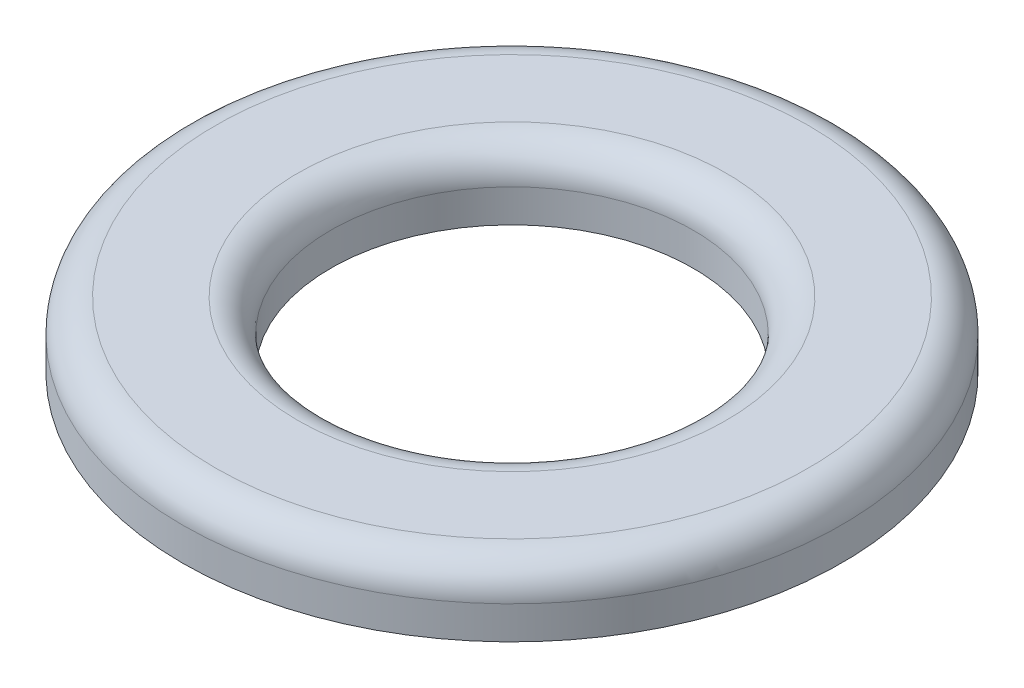
ISO-10303-21;
HEADER;
FILE_DESCRIPTION(('STEP AP214'),'2;1');
FILE_NAME('part.step','',(''),(''),'','','');
FILE_SCHEMA(('AUTOMOTIVE_DESIGN { 1 0 10303 214 1 1 1 1 }'));
ENDSEC;
DATA;
#1=APPLICATION_CONTEXT('core data for automotive mechanical design processes');
#2=APPLICATION_PROTOCOL_DEFINITION('international standard','automotive_design',2000,#1);
#3=PRODUCT_CONTEXT('',#1,'mechanical');
#4=PRODUCT('Part','Part','',(#3));
#5=PRODUCT_RELATED_PRODUCT_CATEGORY('part','',(#4));
#6=PRODUCT_DEFINITION_FORMATION('','',#4);
#7=PRODUCT_DEFINITION_CONTEXT('part definition',#1,'design');
#8=PRODUCT_DEFINITION('design','',#6,#7);
#9=PRODUCT_DEFINITION_SHAPE('','',#8);
#10=(LENGTH_UNIT() NAMED_UNIT(*) SI_UNIT(.MILLI.,.METRE.));
#11=(NAMED_UNIT(*) PLANE_ANGLE_UNIT() SI_UNIT($,.RADIAN.));
#12=(NAMED_UNIT(*) SI_UNIT($,.STERADIAN.) SOLID_ANGLE_UNIT());
#13=UNCERTAINTY_MEASURE_WITH_UNIT(LENGTH_MEASURE(1.E-05),#10,'distance_accuracy_value','');
#14=(GEOMETRIC_REPRESENTATION_CONTEXT(3) GLOBAL_UNCERTAINTY_ASSIGNED_CONTEXT((#13)) GLOBAL_UNIT_ASSIGNED_CONTEXT((#10,
#11,#12)) REPRESENTATION_CONTEXT('',''));
#15=CARTESIAN_POINT('',(0.,0.,0.));
#16=DIRECTION('',(0.,0.,1.));
#17=DIRECTION('',(1.,0.,0.));
#18=AXIS2_PLACEMENT_3D('',#15,#16,#17);
#19=CARTESIAN_POINT('',(0.,0.,0.));
#20=DIRECTION('',(0.,1.,0.));
#21=DIRECTION('',(0.,0.,1.));
#22=AXIS2_PLACEMENT_3D('',#19,#20,#21);
#23=PLANE('',#22);
#24=CARTESIAN_POINT('',(0.,0.,0.));
#25=DIRECTION('',(0.,1.,0.));
#26=DIRECTION('',(0.,0.,1.));
#27=AXIS2_PLACEMENT_3D('',#24,#25,#26);
#28=CIRCLE('',#27,27.5);
#29=CARTESIAN_POINT('',(0.,0.,27.5));
#30=VERTEX_POINT('',#29);
#31=EDGE_CURVE('E48',#30,#30,#28,.T.);
#32=ORIENTED_EDGE('',*,*,#31,.T.);
#33=EDGE_LOOP('',(#32));
#34=FACE_BOUND('',#33,.T.);
#35=CARTESIAN_POINT('',(0.,0.,0.));
#36=DIRECTION('',(0.,-1.,0.));
#37=DIRECTION('',(0.,0.,-1.));
#38=AXIS2_PLACEMENT_3D('',#35,#36,#37);
#39=CIRCLE('',#38,40.);
#40=CARTESIAN_POINT('',(0.,0.,-40.));
#41=VERTEX_POINT('',#40);
#42=EDGE_CURVE('E83',#41,#41,#39,.T.);
#43=ORIENTED_EDGE('',*,*,#42,.T.);
#44=EDGE_LOOP('',(#43));
#45=FACE_BOUND('',#44,.T.);
#46=ADVANCED_FACE('F31',(#34,#45),#23,.F.);
#47=CARTESIAN_POINT('',(0.,10.,0.));
#48=DIRECTION('',(0.,1.,0.));
#49=DIRECTION('',(0.,0.,1.));
#50=AXIS2_PLACEMENT_3D('',#47,#48,#49);
#51=PLANE('',#50);
#52=CARTESIAN_POINT('',(0.,10.,0.));
#53=DIRECTION('',(0.,1.,0.));
#54=DIRECTION('',(0.,0.,1.));
#55=AXIS2_PLACEMENT_3D('',#52,#53,#54);
#56=CIRCLE('',#55,32.5);
#57=CARTESIAN_POINT('',(0.,10.,32.5));
#58=VERTEX_POINT('',#57);
#59=EDGE_CURVE('E43',#58,#58,#56,.F.);
#60=ORIENTED_EDGE('',*,*,#59,.T.);
#61=EDGE_LOOP('',(#60));
#62=FACE_BOUND('',#61,.T.);
#63=CARTESIAN_POINT('',(0.,10.,0.));
#64=DIRECTION('',(0.,1.,0.));
#65=DIRECTION('',(0.,0.,1.));
#66=AXIS2_PLACEMENT_3D('',#63,#64,#65);
#67=CIRCLE('',#66,45.);
#68=CARTESIAN_POINT('',(0.,10.,45.));
#69=VERTEX_POINT('',#68);
#70=EDGE_CURVE('E57',#69,#69,#67,.T.);
#71=ORIENTED_EDGE('',*,*,#70,.T.);
#72=EDGE_LOOP('',(#71));
#73=FACE_BOUND('',#72,.T.);
#74=ADVANCED_FACE('F62',(#62,#73),#51,.T.);
#75=CARTESIAN_POINT('',(0.,0.,0.));
#76=DIRECTION('',(0.,-1.,0.));
#77=DIRECTION('',(0.,0.,-1.));
#78=AXIS2_PLACEMENT_3D('',#75,#76,#77);
#79=CIRCLE('',#78,43.);
#80=CARTESIAN_POINT('',(0.,0.,-43.));
#81=VERTEX_POINT('',#80);
#82=EDGE_CURVE('E10',#81,#81,#79,.T.);
#83=ORIENTED_EDGE('',*,*,#82,.F.);
#84=EDGE_LOOP('',(#83));
#85=FACE_BOUND('',#84,.T.);
#86=CARTESIAN_POINT('',(0.,0.,0.));
#87=DIRECTION('',(0.,1.,0.));
#88=DIRECTION('',(0.,0.,1.));
#89=AXIS2_PLACEMENT_3D('',#86,#87,#88);
#90=CIRCLE('',#89,50.);
#91=CARTESIAN_POINT('',(0.,0.,50.));
#92=VERTEX_POINT('',#91);
#93=EDGE_CURVE('E51',#92,#92,#90,.T.);
#94=ORIENTED_EDGE('',*,*,#93,.F.);
#95=EDGE_LOOP('',(#94));
#96=FACE_BOUND('',#95,.T.);
#97=ADVANCED_FACE('F80',(#85,#96),#23,.F.);
#98=CARTESIAN_POINT('',(0.,10.,0.));
#99=DIRECTION('',(0.,-1.,0.));
#100=DIRECTION('',(0.,0.,-1.));
#101=AXIS2_PLACEMENT_3D('',#98,#99,#100);
#102=CYLINDRICAL_SURFACE('',#101,50.);
#103=CARTESIAN_POINT('',(0.,5.,0.));
#104=DIRECTION('',(0.,1.,0.));
#105=DIRECTION('',(0.,0.,1.));
#106=AXIS2_PLACEMENT_3D('',#103,#104,#105);
#107=CIRCLE('',#106,50.);
#108=CARTESIAN_POINT('',(0.,5.,50.));
#109=VERTEX_POINT('',#108);
#110=EDGE_CURVE('E35',#109,#109,#107,.F.);
#111=ORIENTED_EDGE('',*,*,#110,.T.);
#112=EDGE_LOOP('',(#111));
#113=FACE_BOUND('',#112,.T.);
#114=ORIENTED_EDGE('',*,*,#93,.T.);
#115=EDGE_LOOP('',(#114));
#116=FACE_BOUND('',#115,.T.);
#117=ADVANCED_FACE('F73',(#113,#116),#102,.T.);
#118=CARTESIAN_POINT('',(0.,10.,0.));
#119=DIRECTION('',(0.,-1.,0.));
#120=DIRECTION('',(0.,0.,-1.));
#121=AXIS2_PLACEMENT_3D('',#118,#119,#120);
#122=CYLINDRICAL_SURFACE('',#121,27.5);
#123=CARTESIAN_POINT('',(0.,5.,0.));
#124=DIRECTION('',(0.,1.,0.));
#125=DIRECTION('',(0.,0.,1.));
#126=AXIS2_PLACEMENT_3D('',#123,#124,#125);
#127=CIRCLE('',#126,27.5);
#128=CARTESIAN_POINT('',(0.,5.,27.5));
#129=VERTEX_POINT('',#128);
#130=EDGE_CURVE('E54',#129,#129,#127,.T.);
#131=ORIENTED_EDGE('',*,*,#130,.T.);
#132=EDGE_LOOP('',(#131));
#133=FACE_BOUND('',#132,.T.);
#134=ORIENTED_EDGE('',*,*,#31,.F.);
#135=EDGE_LOOP('',(#134));
#136=FACE_BOUND('',#135,.T.);
#137=ADVANCED_FACE('F68',(#133,#136),#122,.F.);
#138=CARTESIAN_POINT('',(0.,5.,0.));
#139=DIRECTION('',(0.,1.,0.));
#140=DIRECTION('',(0.,0.,1.));
#141=AXIS2_PLACEMENT_3D('',#138,#139,#140);
#142=TOROIDAL_SURFACE('',#141,32.5,5.);
#143=ORIENTED_EDGE('',*,*,#59,.F.);
#144=EDGE_LOOP('',(#143));
#145=FACE_BOUND('',#144,.T.);
#146=ORIENTED_EDGE('',*,*,#130,.F.);
#147=EDGE_LOOP('',(#146));
#148=FACE_BOUND('',#147,.T.);
#149=ADVANCED_FACE('F65',(#145,#148),#142,.T.);
#150=CARTESIAN_POINT('',(0.,5.,0.));
#151=DIRECTION('',(0.,1.,0.));
#152=DIRECTION('',(0.,0.,1.));
#153=AXIS2_PLACEMENT_3D('',#150,#151,#152);
#154=TOROIDAL_SURFACE('',#153,45.,5.);
#155=ORIENTED_EDGE('',*,*,#110,.F.);
#156=EDGE_LOOP('',(#155));
#157=FACE_BOUND('',#156,.T.);
#158=ORIENTED_EDGE('',*,*,#70,.F.);
#159=EDGE_LOOP('',(#158));
#160=FACE_BOUND('',#159,.T.);
#161=ADVANCED_FACE('F33',(#157,#160),#154,.T.);
#162=CARTESIAN_POINT('',(0.,-3.,0.));
#163=DIRECTION('',(0.,-1.,0.));
#164=DIRECTION('',(0.,0.,-1.));
#165=AXIS2_PLACEMENT_3D('',#162,#163,#164);
#166=PLANE('',#165);
#167=CARTESIAN_POINT('',(0.,-3.,0.));
#168=DIRECTION('',(0.,-1.,0.));
#169=DIRECTION('',(0.,0.,-1.));
#170=AXIS2_PLACEMENT_3D('',#167,#168,#169);
#171=CIRCLE('',#170,43.);
#172=CARTESIAN_POINT('',(0.,-3.,-43.));
#173=VERTEX_POINT('',#172);
#174=EDGE_CURVE('E46',#173,#173,#171,.T.);
#175=ORIENTED_EDGE('',*,*,#174,.T.);
#176=EDGE_LOOP('',(#175));
#177=FACE_BOUND('',#176,.T.);
#178=CARTESIAN_POINT('',(0.,-3.,0.));
#179=DIRECTION('',(0.,-1.,0.));
#180=DIRECTION('',(0.,0.,-1.));
#181=AXIS2_PLACEMENT_3D('',#178,#179,#180);
#182=CIRCLE('',#181,40.);
#183=CARTESIAN_POINT('',(0.,-3.,-40.));
#184=VERTEX_POINT('',#183);
#185=EDGE_CURVE('E85',#184,#184,#182,.T.);
#186=ORIENTED_EDGE('',*,*,#185,.F.);
#187=EDGE_LOOP('',(#186));
#188=FACE_BOUND('',#187,.T.);
#189=ADVANCED_FACE('F93',(#177,#188),#166,.T.);
#190=CARTESIAN_POINT('',(0.,-3.,0.));
#191=DIRECTION('',(0.,1.,0.));
#192=DIRECTION('',(0.,0.,1.));
#193=AXIS2_PLACEMENT_3D('',#190,#191,#192);
#194=CYLINDRICAL_SURFACE('',#193,43.);
#195=ORIENTED_EDGE('',*,*,#174,.F.);
#196=EDGE_LOOP('',(#195));
#197=FACE_BOUND('',#196,.T.);
#198=ORIENTED_EDGE('',*,*,#82,.T.);
#199=EDGE_LOOP('',(#198));
#200=FACE_BOUND('',#199,.T.);
#201=ADVANCED_FACE('F96',(#197,#200),#194,.T.);
#202=CARTESIAN_POINT('',(0.,-3.,0.));
#203=DIRECTION('',(0.,1.,0.));
#204=DIRECTION('',(0.,0.,1.));
#205=AXIS2_PLACEMENT_3D('',#202,#203,#204);
#206=CYLINDRICAL_SURFACE('',#205,40.);
#207=ORIENTED_EDGE('',*,*,#185,.T.);
#208=EDGE_LOOP('',(#207));
#209=FACE_BOUND('',#208,.T.);
#210=ORIENTED_EDGE('',*,*,#42,.F.);
#211=EDGE_LOOP('',(#210));
#212=FACE_BOUND('',#211,.T.);
#213=ADVANCED_FACE('F98',(#209,#212),#206,.F.);
#214=CLOSED_SHELL('',(#46,#74,#97,#117,#137,#149,#161,#189,#201,#213));
#215=MANIFOLD_SOLID_BREP('B2',#214);
#216=ADVANCED_BREP_SHAPE_REPRESENTATION('',(#18,#215),#14);
#217=SHAPE_DEFINITION_REPRESENTATION(#9,#216);
ENDSEC;
END-ISO-10303-21;
